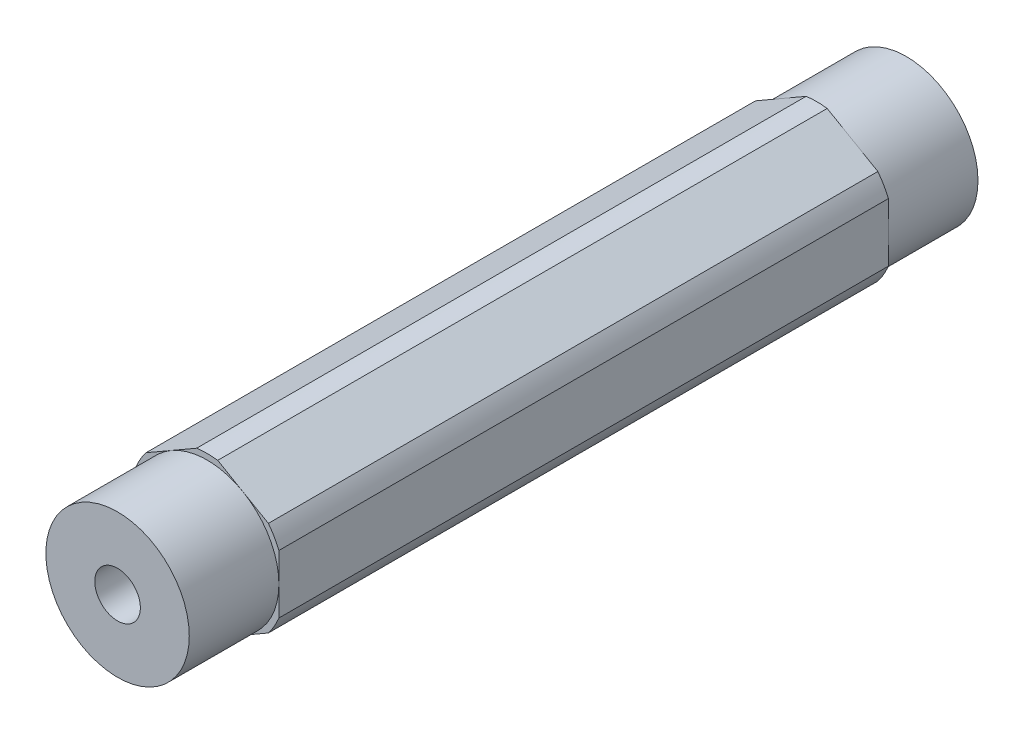
ISO-10303-21;
HEADER;
FILE_DESCRIPTION(('STEP AP214'),'2;1');
FILE_NAME('part.step','',(''),(''),'','','');
FILE_SCHEMA(('AUTOMOTIVE_DESIGN { 1 0 10303 214 1 1 1 1 }'));
ENDSEC;
DATA;
#1=APPLICATION_CONTEXT('core data for automotive mechanical design processes');
#2=APPLICATION_PROTOCOL_DEFINITION('international standard','automotive_design',2000,#1);
#3=PRODUCT_CONTEXT('',#1,'mechanical');
#4=PRODUCT('Part','Part','',(#3));
#5=PRODUCT_RELATED_PRODUCT_CATEGORY('part','',(#4));
#6=PRODUCT_DEFINITION_FORMATION('','',#4);
#7=PRODUCT_DEFINITION_CONTEXT('part definition',#1,'design');
#8=PRODUCT_DEFINITION('design','',#6,#7);
#9=PRODUCT_DEFINITION_SHAPE('','',#8);
#10=(LENGTH_UNIT() NAMED_UNIT(*) SI_UNIT(.MILLI.,.METRE.));
#11=(NAMED_UNIT(*) PLANE_ANGLE_UNIT() SI_UNIT($,.RADIAN.));
#12=(NAMED_UNIT(*) SI_UNIT($,.STERADIAN.) SOLID_ANGLE_UNIT());
#13=UNCERTAINTY_MEASURE_WITH_UNIT(LENGTH_MEASURE(1.E-05),#10,'distance_accuracy_value','');
#14=(GEOMETRIC_REPRESENTATION_CONTEXT(3) GLOBAL_UNCERTAINTY_ASSIGNED_CONTEXT((#13)) GLOBAL_UNIT_ASSIGNED_CONTEXT((#10,
#11,#12)) REPRESENTATION_CONTEXT('',''));
#15=CARTESIAN_POINT('',(0.,0.,0.));
#16=DIRECTION('',(0.,0.,1.));
#17=DIRECTION('',(1.,0.,0.));
#18=AXIS2_PLACEMENT_3D('',#15,#16,#17);
#19=CARTESIAN_POINT('',(0.,0.,-26.9875));
#20=DIRECTION('',(0.,0.,1.));
#21=DIRECTION('',(1.,0.,0.));
#22=AXIS2_PLACEMENT_3D('',#19,#20,#21);
#23=PLANE('',#22);
#24=DIRECTION('',(0.,1.,0.));
#25=VECTOR('',#24,1.);
#26=CARTESIAN_POINT('',(6.35,0.,-26.9875));
#27=LINE('',#26,#25);
#28=CARTESIAN_POINT('',(6.35,0.,-26.9875));
#29=VERTEX_POINT('',#28);
#30=CARTESIAN_POINT('',(6.35,2.59030191290514,-26.9875));
#31=VERTEX_POINT('',#30);
#32=EDGE_CURVE('E175',#29,#31,#27,.T.);
#33=ORIENTED_EDGE('',*,*,#32,.F.);
#34=CARTESIAN_POINT('',(0.,0.,-26.9875));
#35=DIRECTION('',(0.,0.,1.));
#36=DIRECTION('',(1.,0.,0.));
#37=AXIS2_PLACEMENT_3D('',#34,#35,#36);
#38=CIRCLE('',#37,6.35);
#39=CARTESIAN_POINT('',(3.175,5.49926131403119,-26.9875));
#40=VERTEX_POINT('',#39);
#41=EDGE_CURVE('E50',#29,#40,#38,.T.);
#42=ORIENTED_EDGE('',*,*,#41,.T.);
#43=DIRECTION('',(-0.866025403784439,0.5,0.));
#44=VECTOR('',#43,1.);
#45=CARTESIAN_POINT('',(3.175,5.49926131403119,-26.9875));
#46=LINE('',#45,#44);
#47=CARTESIAN_POINT('',(5.41826726004727,4.20411035757862,-26.9875));
#48=VERTEX_POINT('',#47);
#49=EDGE_CURVE('E174',#48,#40,#46,.T.);
#50=ORIENTED_EDGE('',*,*,#49,.F.);
#51=CARTESIAN_POINT('',(0.,0.,-26.9875));
#52=DIRECTION('',(0.,0.,1.));
#53=DIRECTION('',(1.,0.,0.));
#54=AXIS2_PLACEMENT_3D('',#51,#52,#53);
#55=CIRCLE('',#54,6.858);
#56=EDGE_CURVE('E187',#31,#48,#55,.T.);
#57=ORIENTED_EDGE('',*,*,#56,.F.);
#58=EDGE_LOOP('',(#33,#42,#50,#57));
#59=FACE_BOUND('',#58,.T.);
#60=ADVANCED_FACE('F39',(#59),#23,.F.);
#61=CARTESIAN_POINT('',(0.931732739952725,6.79441227048375,-26.9875));
#62=VERTEX_POINT('',#61);
#63=EDGE_CURVE('E181',#40,#62,#46,.T.);
#64=ORIENTED_EDGE('',*,*,#63,.F.);
#65=CARTESIAN_POINT('',(-3.175,5.49926131403119,-26.9875));
#66=VERTEX_POINT('',#65);
#67=EDGE_CURVE('E11',#40,#66,#38,.T.);
#68=ORIENTED_EDGE('',*,*,#67,.T.);
#69=DIRECTION('',(-0.866025403784439,-0.5,0.));
#70=VECTOR('',#69,1.);
#71=CARTESIAN_POINT('',(-3.175,5.49926131403118,-26.9875));
#72=LINE('',#71,#70);
#73=CARTESIAN_POINT('',(-0.931732739952721,6.79441227048375,-26.9875));
#74=VERTEX_POINT('',#73);
#75=EDGE_CURVE('E199',#74,#66,#72,.T.);
#76=ORIENTED_EDGE('',*,*,#75,.F.);
#77=EDGE_CURVE('E183',#62,#74,#55,.T.);
#78=ORIENTED_EDGE('',*,*,#77,.F.);
#79=EDGE_LOOP('',(#64,#68,#76,#78));
#80=FACE_BOUND('',#79,.T.);
#81=ADVANCED_FACE('F182',(#80),#23,.F.);
#82=CARTESIAN_POINT('',(-5.41826726004728,4.20411035757862,-26.9875));
#83=VERTEX_POINT('',#82);
#84=EDGE_CURVE('E194',#66,#83,#72,.T.);
#85=ORIENTED_EDGE('',*,*,#84,.F.);
#86=CARTESIAN_POINT('',(-6.35,0.,-26.9875));
#87=VERTEX_POINT('',#86);
#88=EDGE_CURVE('E48',#66,#87,#38,.T.);
#89=ORIENTED_EDGE('',*,*,#88,.T.);
#90=DIRECTION('',(0.,-1.,0.));
#91=VECTOR('',#90,1.);
#92=CARTESIAN_POINT('',(-6.35,0.,-26.9875));
#93=LINE('',#92,#91);
#94=CARTESIAN_POINT('',(-6.35,2.59030191290514,-26.9875));
#95=VERTEX_POINT('',#94);
#96=EDGE_CURVE('E202',#95,#87,#93,.T.);
#97=ORIENTED_EDGE('',*,*,#96,.F.);
#98=EDGE_CURVE('E196',#83,#95,#55,.T.);
#99=ORIENTED_EDGE('',*,*,#98,.F.);
#100=EDGE_LOOP('',(#85,#89,#97,#99));
#101=FACE_BOUND('',#100,.T.);
#102=ADVANCED_FACE('F376',(#101),#23,.F.);
#103=CARTESIAN_POINT('',(-6.35,-2.59030191290514,-26.9875));
#104=VERTEX_POINT('',#103);
#105=EDGE_CURVE('E206',#87,#104,#93,.T.);
#106=ORIENTED_EDGE('',*,*,#105,.F.);
#107=CARTESIAN_POINT('',(-3.175,-5.49926131403119,-26.9875));
#108=VERTEX_POINT('',#107);
#109=EDGE_CURVE('E340',#87,#108,#38,.T.);
#110=ORIENTED_EDGE('',*,*,#109,.T.);
#111=DIRECTION('',(0.866025403784439,-0.5,0.));
#112=VECTOR('',#111,1.);
#113=CARTESIAN_POINT('',(-3.175,-5.49926131403118,-26.9875));
#114=LINE('',#113,#112);
#115=CARTESIAN_POINT('',(-5.41826726004728,-4.20411035757861,-26.9875));
#116=VERTEX_POINT('',#115);
#117=EDGE_CURVE('E207',#116,#108,#114,.T.);
#118=ORIENTED_EDGE('',*,*,#117,.F.);
#119=EDGE_CURVE('E205',#104,#116,#55,.T.);
#120=ORIENTED_EDGE('',*,*,#119,.F.);
#121=EDGE_LOOP('',(#106,#110,#118,#120));
#122=FACE_BOUND('',#121,.T.);
#123=ADVANCED_FACE('F339',(#122),#23,.F.);
#124=CARTESIAN_POINT('',(-0.931732739952714,-6.79441227048375,-26.9875));
#125=VERTEX_POINT('',#124);
#126=EDGE_CURVE('E211',#108,#125,#114,.T.);
#127=ORIENTED_EDGE('',*,*,#126,.F.);
#128=CARTESIAN_POINT('',(3.175,-5.49926131403119,-26.9875));
#129=VERTEX_POINT('',#128);
#130=EDGE_CURVE('E269',#108,#129,#38,.T.);
#131=ORIENTED_EDGE('',*,*,#130,.T.);
#132=DIRECTION('',(0.866025403784439,0.5,0.));
#133=VECTOR('',#132,1.);
#134=CARTESIAN_POINT('',(3.175,-5.49926131403119,-26.9875));
#135=LINE('',#134,#133);
#136=CARTESIAN_POINT('',(0.931732739952726,-6.79441227048375,-26.9875));
#137=VERTEX_POINT('',#136);
#138=EDGE_CURVE('E212',#137,#129,#135,.T.);
#139=ORIENTED_EDGE('',*,*,#138,.F.);
#140=EDGE_CURVE('E210',#125,#137,#55,.T.);
#141=ORIENTED_EDGE('',*,*,#140,.F.);
#142=EDGE_LOOP('',(#127,#131,#139,#141));
#143=FACE_BOUND('',#142,.T.);
#144=ADVANCED_FACE('F360',(#143),#23,.F.);
#145=CARTESIAN_POINT('',(0.,0.,26.9875));
#146=DIRECTION('',(0.,0.,1.));
#147=DIRECTION('',(1.,0.,0.));
#148=AXIS2_PLACEMENT_3D('',#145,#146,#147);
#149=PLANE('',#148);
#150=CARTESIAN_POINT('',(0.,0.,26.9875));
#151=DIRECTION('',(0.,0.,1.));
#152=DIRECTION('',(1.,0.,0.));
#153=AXIS2_PLACEMENT_3D('',#150,#151,#152);
#154=CIRCLE('',#153,6.35);
#155=CARTESIAN_POINT('',(6.35,0.,26.9875));
#156=VERTEX_POINT('',#155);
#157=CARTESIAN_POINT('',(3.175,5.49926131403119,26.9875));
#158=VERTEX_POINT('',#157);
#159=EDGE_CURVE('E252',#156,#158,#154,.T.);
#160=ORIENTED_EDGE('',*,*,#159,.F.);
#161=DIRECTION('',(0.,1.,0.));
#162=VECTOR('',#161,1.);
#163=CARTESIAN_POINT('',(6.35,0.,26.9875));
#164=LINE('',#163,#162);
#165=CARTESIAN_POINT('',(6.35,2.59030191290514,26.9875));
#166=VERTEX_POINT('',#165);
#167=EDGE_CURVE('E320',#156,#166,#164,.T.);
#168=ORIENTED_EDGE('',*,*,#167,.T.);
#169=CARTESIAN_POINT('',(0.,0.,26.9875));
#170=DIRECTION('',(0.,0.,1.));
#171=DIRECTION('',(1.,0.,0.));
#172=AXIS2_PLACEMENT_3D('',#169,#170,#171);
#173=CIRCLE('',#172,6.858);
#174=CARTESIAN_POINT('',(5.41826726004727,4.20411035757862,26.9875));
#175=VERTEX_POINT('',#174);
#176=EDGE_CURVE('E311',#166,#175,#173,.T.);
#177=ORIENTED_EDGE('',*,*,#176,.T.);
#178=DIRECTION('',(-0.866025403784439,0.5,0.));
#179=VECTOR('',#178,1.);
#180=CARTESIAN_POINT('',(3.175,5.49926131403119,26.9875));
#181=LINE('',#180,#179);
#182=EDGE_CURVE('E314',#175,#158,#181,.T.);
#183=ORIENTED_EDGE('',*,*,#182,.T.);
#184=EDGE_LOOP('',(#160,#168,#177,#183));
#185=FACE_BOUND('',#184,.T.);
#186=ADVANCED_FACE('F357',(#185),#149,.T.);
#187=CARTESIAN_POINT('',(-3.175,5.49926131403119,26.9875));
#188=VERTEX_POINT('',#187);
#189=EDGE_CURVE('E261',#158,#188,#154,.T.);
#190=ORIENTED_EDGE('',*,*,#189,.F.);
#191=CARTESIAN_POINT('',(0.931732739952725,6.79441227048375,26.9875));
#192=VERTEX_POINT('',#191);
#193=EDGE_CURVE('E315',#158,#192,#181,.T.);
#194=ORIENTED_EDGE('',*,*,#193,.T.);
#195=CARTESIAN_POINT('',(-0.931732739952721,6.79441227048375,26.9875));
#196=VERTEX_POINT('',#195);
#197=EDGE_CURVE('E317',#192,#196,#173,.T.);
#198=ORIENTED_EDGE('',*,*,#197,.T.);
#199=DIRECTION('',(-0.866025403784439,-0.5,0.));
#200=VECTOR('',#199,1.);
#201=CARTESIAN_POINT('',(-3.175,5.49926131403118,26.9875));
#202=LINE('',#201,#200);
#203=EDGE_CURVE('E299',#196,#188,#202,.T.);
#204=ORIENTED_EDGE('',*,*,#203,.T.);
#205=EDGE_LOOP('',(#190,#194,#198,#204));
#206=FACE_BOUND('',#205,.T.);
#207=ADVANCED_FACE('F359',(#206),#149,.T.);
#208=CARTESIAN_POINT('',(-6.35,0.,26.9875));
#209=VERTEX_POINT('',#208);
#210=EDGE_CURVE('E267',#188,#209,#154,.T.);
#211=ORIENTED_EDGE('',*,*,#210,.F.);
#212=CARTESIAN_POINT('',(-5.41826726004728,4.20411035757862,26.9875));
#213=VERTEX_POINT('',#212);
#214=EDGE_CURVE('E318',#188,#213,#202,.T.);
#215=ORIENTED_EDGE('',*,*,#214,.T.);
#216=CARTESIAN_POINT('',(-6.35,2.59030191290514,26.9875));
#217=VERTEX_POINT('',#216);
#218=EDGE_CURVE('E286',#213,#217,#173,.T.);
#219=ORIENTED_EDGE('',*,*,#218,.T.);
#220=DIRECTION('',(0.,-1.,0.));
#221=VECTOR('',#220,1.);
#222=CARTESIAN_POINT('',(-6.35,0.,26.9875));
#223=LINE('',#222,#221);
#224=EDGE_CURVE('E284',#217,#209,#223,.T.);
#225=ORIENTED_EDGE('',*,*,#224,.T.);
#226=EDGE_LOOP('',(#211,#215,#219,#225));
#227=FACE_BOUND('',#226,.T.);
#228=ADVANCED_FACE('F289',(#227),#149,.T.);
#229=CARTESIAN_POINT('',(-3.175,-5.49926131403118,26.9875));
#230=VERTEX_POINT('',#229);
#231=EDGE_CURVE('E256',#209,#230,#154,.T.);
#232=ORIENTED_EDGE('',*,*,#231,.F.);
#233=CARTESIAN_POINT('',(-6.35,-2.59030191290514,26.9875));
#234=VERTEX_POINT('',#233);
#235=EDGE_CURVE('E276',#209,#234,#223,.T.);
#236=ORIENTED_EDGE('',*,*,#235,.T.);
#237=CARTESIAN_POINT('',(-5.41826726004728,-4.20411035757861,26.9875));
#238=VERTEX_POINT('',#237);
#239=EDGE_CURVE('E293',#234,#238,#173,.T.);
#240=ORIENTED_EDGE('',*,*,#239,.T.);
#241=DIRECTION('',(0.866025403784439,-0.5,0.));
#242=VECTOR('',#241,1.);
#243=CARTESIAN_POINT('',(-3.175,-5.49926131403118,26.9875));
#244=LINE('',#243,#242);
#245=EDGE_CURVE('E279',#238,#230,#244,.T.);
#246=ORIENTED_EDGE('',*,*,#245,.T.);
#247=EDGE_LOOP('',(#232,#236,#240,#246));
#248=FACE_BOUND('',#247,.T.);
#249=ADVANCED_FACE('F275',(#248),#149,.T.);
#250=CARTESIAN_POINT('',(3.175,-5.49926131403119,26.9875));
#251=VERTEX_POINT('',#250);
#252=EDGE_CURVE('E250',#230,#251,#154,.T.);
#253=ORIENTED_EDGE('',*,*,#252,.F.);
#254=CARTESIAN_POINT('',(-0.931732739952714,-6.79441227048375,26.9875));
#255=VERTEX_POINT('',#254);
#256=EDGE_CURVE('E294',#230,#255,#244,.T.);
#257=ORIENTED_EDGE('',*,*,#256,.T.);
#258=CARTESIAN_POINT('',(0.931732739952726,-6.79441227048375,26.9875));
#259=VERTEX_POINT('',#258);
#260=EDGE_CURVE('E296',#255,#259,#173,.T.);
#261=ORIENTED_EDGE('',*,*,#260,.T.);
#262=DIRECTION('',(0.866025403784439,0.5,0.));
#263=VECTOR('',#262,1.);
#264=CARTESIAN_POINT('',(3.175,-5.49926131403119,26.9875));
#265=LINE('',#264,#263);
#266=EDGE_CURVE('E302',#259,#251,#265,.T.);
#267=ORIENTED_EDGE('',*,*,#266,.T.);
#268=EDGE_LOOP('',(#253,#257,#261,#267));
#269=FACE_BOUND('',#268,.T.);
#270=ADVANCED_FACE('F348',(#269),#149,.T.);
#271=CARTESIAN_POINT('',(6.35,0.,26.9875));
#272=DIRECTION('',(-1.,0.,0.));
#273=DIRECTION('',(0.,-1.,0.));
#274=AXIS2_PLACEMENT_3D('',#271,#272,#273);
#275=PLANE('',#274);
#276=CARTESIAN_POINT('',(6.35,-2.59030191290513,-26.9875));
#277=VERTEX_POINT('',#276);
#278=EDGE_CURVE('E305',#277,#29,#27,.T.);
#279=ORIENTED_EDGE('',*,*,#278,.T.);
#280=ORIENTED_EDGE('',*,*,#32,.T.);
#281=DIRECTION('',(0.,0.,-1.));
#282=VECTOR('',#281,1.);
#283=CARTESIAN_POINT('',(6.35,2.59030191290514,26.9875));
#284=LINE('',#283,#282);
#285=EDGE_CURVE('E43',#166,#31,#284,.T.);
#286=ORIENTED_EDGE('',*,*,#285,.F.);
#287=ORIENTED_EDGE('',*,*,#167,.F.);
#288=CARTESIAN_POINT('',(6.35,-2.59030191290513,26.9875));
#289=VERTEX_POINT('',#288);
#290=EDGE_CURVE('E319',#289,#156,#164,.T.);
#291=ORIENTED_EDGE('',*,*,#290,.F.);
#292=DIRECTION('',(0.,0.,-1.));
#293=VECTOR('',#292,1.);
#294=CARTESIAN_POINT('',(6.35,-2.59030191290513,26.9875));
#295=LINE('',#294,#293);
#296=EDGE_CURVE('E217',#289,#277,#295,.T.);
#297=ORIENTED_EDGE('',*,*,#296,.T.);
#298=EDGE_LOOP('',(#279,#280,#286,#287,#291,#297));
#299=FACE_BOUND('',#298,.T.);
#300=ADVANCED_FACE('F308',(#299),#275,.F.);
#301=CARTESIAN_POINT('',(0.,0.,26.9875));
#302=DIRECTION('',(0.,0.,-1.));
#303=DIRECTION('',(-1.,0.,0.));
#304=AXIS2_PLACEMENT_3D('',#301,#302,#303);
#305=CYLINDRICAL_SURFACE('',#304,6.858);
#306=ORIENTED_EDGE('',*,*,#56,.T.);
#307=DIRECTION('',(0.,0.,-1.));
#308=VECTOR('',#307,1.);
#309=CARTESIAN_POINT('',(5.41826726004727,4.20411035757862,26.9875));
#310=LINE('',#309,#308);
#311=EDGE_CURVE('E193',#175,#48,#310,.T.);
#312=ORIENTED_EDGE('',*,*,#311,.F.);
#313=ORIENTED_EDGE('',*,*,#176,.F.);
#314=ORIENTED_EDGE('',*,*,#285,.T.);
#315=EDGE_LOOP('',(#306,#312,#313,#314));
#316=FACE_BOUND('',#315,.T.);
#317=ADVANCED_FACE('F310',(#316),#305,.T.);
#318=CARTESIAN_POINT('',(3.175,5.49926131403119,26.9875));
#319=DIRECTION('',(-0.5,-0.866025403784439,0.));
#320=DIRECTION('',(0.866025403784439,-0.5,0.));
#321=AXIS2_PLACEMENT_3D('',#318,#319,#320);
#322=PLANE('',#321);
#323=ORIENTED_EDGE('',*,*,#49,.T.);
#324=ORIENTED_EDGE('',*,*,#63,.T.);
#325=DIRECTION('',(0.,0.,-1.));
#326=VECTOR('',#325,1.);
#327=CARTESIAN_POINT('',(0.931732739952725,6.79441227048375,26.9875));
#328=LINE('',#327,#326);
#329=EDGE_CURVE('E245',#192,#62,#328,.T.);
#330=ORIENTED_EDGE('',*,*,#329,.F.);
#331=ORIENTED_EDGE('',*,*,#193,.F.);
#332=ORIENTED_EDGE('',*,*,#182,.F.);
#333=ORIENTED_EDGE('',*,*,#311,.T.);
#334=EDGE_LOOP('',(#323,#324,#330,#331,#332,#333));
#335=FACE_BOUND('',#334,.T.);
#336=ADVANCED_FACE('F190',(#335),#322,.F.);
#337=ORIENTED_EDGE('',*,*,#77,.T.);
#338=DIRECTION('',(0.,0.,-1.));
#339=VECTOR('',#338,1.);
#340=CARTESIAN_POINT('',(-0.931732739952721,6.79441227048375,26.9875));
#341=LINE('',#340,#339);
#342=EDGE_CURVE('E242',#196,#74,#341,.T.);
#343=ORIENTED_EDGE('',*,*,#342,.F.);
#344=ORIENTED_EDGE('',*,*,#197,.F.);
#345=ORIENTED_EDGE('',*,*,#329,.T.);
#346=EDGE_LOOP('',(#337,#343,#344,#345));
#347=FACE_BOUND('',#346,.T.);
#348=ADVANCED_FACE('F419',(#347),#305,.T.);
#349=CARTESIAN_POINT('',(-3.175,5.49926131403118,26.9875));
#350=DIRECTION('',(0.5,-0.866025403784439,0.));
#351=DIRECTION('',(0.866025403784439,0.5,0.));
#352=AXIS2_PLACEMENT_3D('',#349,#350,#351);
#353=PLANE('',#352);
#354=ORIENTED_EDGE('',*,*,#75,.T.);
#355=ORIENTED_EDGE('',*,*,#84,.T.);
#356=DIRECTION('',(0.,0.,-1.));
#357=VECTOR('',#356,1.);
#358=CARTESIAN_POINT('',(-5.41826726004728,4.20411035757862,26.9875));
#359=LINE('',#358,#357);
#360=EDGE_CURVE('E239',#213,#83,#359,.T.);
#361=ORIENTED_EDGE('',*,*,#360,.F.);
#362=ORIENTED_EDGE('',*,*,#214,.F.);
#363=ORIENTED_EDGE('',*,*,#203,.F.);
#364=ORIENTED_EDGE('',*,*,#342,.T.);
#365=EDGE_LOOP('',(#354,#355,#361,#362,#363,#364));
#366=FACE_BOUND('',#365,.T.);
#367=ADVANCED_FACE('F416',(#366),#353,.F.);
#368=ORIENTED_EDGE('',*,*,#98,.T.);
#369=DIRECTION('',(0.,0.,-1.));
#370=VECTOR('',#369,1.);
#371=CARTESIAN_POINT('',(-6.35,2.59030191290514,26.9875));
#372=LINE('',#371,#370);
#373=EDGE_CURVE('E236',#217,#95,#372,.T.);
#374=ORIENTED_EDGE('',*,*,#373,.F.);
#375=ORIENTED_EDGE('',*,*,#218,.F.);
#376=ORIENTED_EDGE('',*,*,#360,.T.);
#377=EDGE_LOOP('',(#368,#374,#375,#376));
#378=FACE_BOUND('',#377,.T.);
#379=ADVANCED_FACE('F415',(#378),#305,.T.);
#380=CARTESIAN_POINT('',(-6.35,0.,26.9875));
#381=DIRECTION('',(1.,0.,0.));
#382=DIRECTION('',(0.,1.,0.));
#383=AXIS2_PLACEMENT_3D('',#380,#381,#382);
#384=PLANE('',#383);
#385=ORIENTED_EDGE('',*,*,#96,.T.);
#386=ORIENTED_EDGE('',*,*,#105,.T.);
#387=DIRECTION('',(0.,0.,-1.));
#388=VECTOR('',#387,1.);
#389=CARTESIAN_POINT('',(-6.35,-2.59030191290514,26.9875));
#390=LINE('',#389,#388);
#391=EDGE_CURVE('E233',#234,#104,#390,.T.);
#392=ORIENTED_EDGE('',*,*,#391,.F.);
#393=ORIENTED_EDGE('',*,*,#235,.F.);
#394=ORIENTED_EDGE('',*,*,#224,.F.);
#395=ORIENTED_EDGE('',*,*,#373,.T.);
#396=EDGE_LOOP('',(#385,#386,#392,#393,#394,#395));
#397=FACE_BOUND('',#396,.T.);
#398=ADVANCED_FACE('F283',(#397),#384,.F.);
#399=ORIENTED_EDGE('',*,*,#119,.T.);
#400=DIRECTION('',(0.,0.,-1.));
#401=VECTOR('',#400,1.);
#402=CARTESIAN_POINT('',(-5.41826726004728,-4.20411035757861,26.9875));
#403=LINE('',#402,#401);
#404=EDGE_CURVE('E230',#238,#116,#403,.T.);
#405=ORIENTED_EDGE('',*,*,#404,.F.);
#406=ORIENTED_EDGE('',*,*,#239,.F.);
#407=ORIENTED_EDGE('',*,*,#391,.T.);
#408=EDGE_LOOP('',(#399,#405,#406,#407));
#409=FACE_BOUND('',#408,.T.);
#410=ADVANCED_FACE('F337',(#409),#305,.T.);
#411=CARTESIAN_POINT('',(-3.175,-5.49926131403118,26.9875));
#412=DIRECTION('',(0.5,0.866025403784439,0.));
#413=DIRECTION('',(-0.866025403784439,0.5,0.));
#414=AXIS2_PLACEMENT_3D('',#411,#412,#413);
#415=PLANE('',#414);
#416=ORIENTED_EDGE('',*,*,#117,.T.);
#417=ORIENTED_EDGE('',*,*,#126,.T.);
#418=DIRECTION('',(0.,0.,-1.));
#419=VECTOR('',#418,1.);
#420=CARTESIAN_POINT('',(-0.931732739952714,-6.79441227048375,26.9875));
#421=LINE('',#420,#419);
#422=EDGE_CURVE('E227',#255,#125,#421,.T.);
#423=ORIENTED_EDGE('',*,*,#422,.F.);
#424=ORIENTED_EDGE('',*,*,#256,.F.);
#425=ORIENTED_EDGE('',*,*,#245,.F.);
#426=ORIENTED_EDGE('',*,*,#404,.T.);
#427=EDGE_LOOP('',(#416,#417,#423,#424,#425,#426));
#428=FACE_BOUND('',#427,.T.);
#429=ADVANCED_FACE('F343',(#428),#415,.F.);
#430=ORIENTED_EDGE('',*,*,#140,.T.);
#431=DIRECTION('',(0.,0.,-1.));
#432=VECTOR('',#431,1.);
#433=CARTESIAN_POINT('',(0.931732739952726,-6.79441227048375,26.9875));
#434=LINE('',#433,#432);
#435=EDGE_CURVE('E224',#259,#137,#434,.T.);
#436=ORIENTED_EDGE('',*,*,#435,.F.);
#437=ORIENTED_EDGE('',*,*,#260,.F.);
#438=ORIENTED_EDGE('',*,*,#422,.T.);
#439=EDGE_LOOP('',(#430,#436,#437,#438));
#440=FACE_BOUND('',#439,.T.);
#441=ADVANCED_FACE('F403',(#440),#305,.T.);
#442=CARTESIAN_POINT('',(3.175,-5.49926131403119,26.9875));
#443=DIRECTION('',(-0.5,0.866025403784439,0.));
#444=DIRECTION('',(-0.866025403784439,-0.5,0.));
#445=AXIS2_PLACEMENT_3D('',#442,#443,#444);
#446=PLANE('',#445);
#447=ORIENTED_EDGE('',*,*,#138,.T.);
#448=CARTESIAN_POINT('',(5.41826726004727,-4.20411035757862,-26.9875));
#449=VERTEX_POINT('',#448);
#450=EDGE_CURVE('E216',#129,#449,#135,.T.);
#451=ORIENTED_EDGE('',*,*,#450,.T.);
#452=DIRECTION('',(0.,0.,-1.));
#453=VECTOR('',#452,1.);
#454=CARTESIAN_POINT('',(5.41826726004727,-4.20411035757862,26.9875));
#455=LINE('',#454,#453);
#456=CARTESIAN_POINT('',(5.41826726004727,-4.20411035757862,26.9875));
#457=VERTEX_POINT('',#456);
#458=EDGE_CURVE('E220',#457,#449,#455,.T.);
#459=ORIENTED_EDGE('',*,*,#458,.F.);
#460=EDGE_CURVE('E304',#251,#457,#265,.T.);
#461=ORIENTED_EDGE('',*,*,#460,.F.);
#462=ORIENTED_EDGE('',*,*,#266,.F.);
#463=ORIENTED_EDGE('',*,*,#435,.T.);
#464=EDGE_LOOP('',(#447,#451,#459,#461,#462,#463));
#465=FACE_BOUND('',#464,.T.);
#466=ADVANCED_FACE('F351',(#465),#446,.F.);
#467=CARTESIAN_POINT('',(0.,0.,26.9875));
#468=DIRECTION('',(0.,0.,-1.));
#469=DIRECTION('',(-1.,0.,0.));
#470=AXIS2_PLACEMENT_3D('',#467,#468,#469);
#471=CYLINDRICAL_SURFACE('',#470,2.0193);
#472=CARTESIAN_POINT('',(0.,0.,34.925));
#473=DIRECTION('',(0.,0.,1.));
#474=DIRECTION('',(1.,0.,0.));
#475=AXIS2_PLACEMENT_3D('',#472,#473,#474);
#476=CIRCLE('',#475,2.0193);
#477=CARTESIAN_POINT('',(2.0193,0.,34.925));
#478=VERTEX_POINT('',#477);
#479=EDGE_CURVE('E260',#478,#478,#476,.T.);
#480=ORIENTED_EDGE('',*,*,#479,.T.);
#481=EDGE_LOOP('',(#480));
#482=FACE_BOUND('',#481,.T.);
#483=CARTESIAN_POINT('',(0.,0.,-34.925));
#484=DIRECTION('',(0.,0.,1.));
#485=DIRECTION('',(1.,0.,0.));
#486=AXIS2_PLACEMENT_3D('',#483,#484,#485);
#487=CIRCLE('',#486,2.0193);
#488=CARTESIAN_POINT('',(2.0193,0.,-34.925));
#489=VERTEX_POINT('',#488);
#490=EDGE_CURVE('E178',#489,#489,#487,.T.);
#491=ORIENTED_EDGE('',*,*,#490,.F.);
#492=EDGE_LOOP('',(#491));
#493=FACE_BOUND('',#492,.T.);
#494=ADVANCED_FACE('F41',(#482,#493),#471,.F.);
#495=EDGE_CURVE('E215',#449,#277,#55,.T.);
#496=ORIENTED_EDGE('',*,*,#495,.T.);
#497=ORIENTED_EDGE('',*,*,#296,.F.);
#498=EDGE_CURVE('E221',#457,#289,#173,.T.);
#499=ORIENTED_EDGE('',*,*,#498,.F.);
#500=ORIENTED_EDGE('',*,*,#458,.T.);
#501=EDGE_LOOP('',(#496,#497,#499,#500));
#502=FACE_BOUND('',#501,.T.);
#503=ADVANCED_FACE('F356',(#502),#305,.T.);
#504=EDGE_CURVE('E64',#251,#156,#154,.T.);
#505=ORIENTED_EDGE('',*,*,#504,.F.);
#506=ORIENTED_EDGE('',*,*,#460,.T.);
#507=ORIENTED_EDGE('',*,*,#498,.T.);
#508=ORIENTED_EDGE('',*,*,#290,.T.);
#509=EDGE_LOOP('',(#505,#506,#507,#508));
#510=FACE_BOUND('',#509,.T.);
#511=ADVANCED_FACE('F355',(#510),#149,.T.);
#512=ORIENTED_EDGE('',*,*,#450,.F.);
#513=EDGE_CURVE('E179',#129,#29,#38,.T.);
#514=ORIENTED_EDGE('',*,*,#513,.T.);
#515=ORIENTED_EDGE('',*,*,#278,.F.);
#516=ORIENTED_EDGE('',*,*,#495,.F.);
#517=EDGE_LOOP('',(#512,#514,#515,#516));
#518=FACE_BOUND('',#517,.T.);
#519=ADVANCED_FACE('F369',(#518),#23,.F.);
#520=CARTESIAN_POINT('',(0.,0.,34.925));
#521=DIRECTION('',(0.,0.,1.));
#522=DIRECTION('',(1.,0.,0.));
#523=AXIS2_PLACEMENT_3D('',#520,#521,#522);
#524=PLANE('',#523);
#525=CARTESIAN_POINT('',(0.,0.,34.925));
#526=DIRECTION('',(0.,0.,1.));
#527=DIRECTION('',(1.,0.,0.));
#528=AXIS2_PLACEMENT_3D('',#525,#526,#527);
#529=CIRCLE('',#528,6.35);
#530=CARTESIAN_POINT('',(6.35,0.,34.925));
#531=VERTEX_POINT('',#530);
#532=EDGE_CURVE('E259',#531,#531,#529,.T.);
#533=ORIENTED_EDGE('',*,*,#532,.T.);
#534=EDGE_LOOP('',(#533));
#535=FACE_BOUND('',#534,.T.);
#536=ORIENTED_EDGE('',*,*,#479,.F.);
#537=EDGE_LOOP('',(#536));
#538=FACE_BOUND('',#537,.T.);
#539=ADVANCED_FACE('F379',(#535,#538),#524,.T.);
#540=CARTESIAN_POINT('',(0.,0.,34.925));
#541=DIRECTION('',(0.,0.,-1.));
#542=DIRECTION('',(-1.,0.,0.));
#543=AXIS2_PLACEMENT_3D('',#540,#541,#542);
#544=CYLINDRICAL_SURFACE('',#543,6.35);
#545=ORIENTED_EDGE('',*,*,#532,.F.);
#546=EDGE_LOOP('',(#545));
#547=FACE_BOUND('',#546,.T.);
#548=ORIENTED_EDGE('',*,*,#159,.T.);
#549=ORIENTED_EDGE('',*,*,#189,.T.);
#550=ORIENTED_EDGE('',*,*,#210,.T.);
#551=ORIENTED_EDGE('',*,*,#231,.T.);
#552=ORIENTED_EDGE('',*,*,#252,.T.);
#553=ORIENTED_EDGE('',*,*,#504,.T.);
#554=EDGE_LOOP('',(#548,#549,#550,#551,#552,#553));
#555=FACE_BOUND('',#554,.T.);
#556=ADVANCED_FACE('F271',(#547,#555),#544,.T.);
#557=CARTESIAN_POINT('',(0.,0.,-34.925));
#558=DIRECTION('',(0.,0.,1.));
#559=DIRECTION('',(1.,0.,0.));
#560=AXIS2_PLACEMENT_3D('',#557,#558,#559);
#561=CYLINDRICAL_SURFACE('',#560,6.35);
#562=CARTESIAN_POINT('',(0.,0.,-34.925));
#563=DIRECTION('',(0.,0.,1.));
#564=DIRECTION('',(1.,0.,0.));
#565=AXIS2_PLACEMENT_3D('',#562,#563,#564);
#566=CIRCLE('',#565,6.35);
#567=CARTESIAN_POINT('',(6.35,0.,-34.925));
#568=VERTEX_POINT('',#567);
#569=EDGE_CURVE('E177',#568,#568,#566,.T.);
#570=ORIENTED_EDGE('',*,*,#569,.T.);
#571=EDGE_LOOP('',(#570));
#572=FACE_BOUND('',#571,.T.);
#573=ORIENTED_EDGE('',*,*,#41,.F.);
#574=ORIENTED_EDGE('',*,*,#513,.F.);
#575=ORIENTED_EDGE('',*,*,#130,.F.);
#576=ORIENTED_EDGE('',*,*,#109,.F.);
#577=ORIENTED_EDGE('',*,*,#88,.F.);
#578=ORIENTED_EDGE('',*,*,#67,.F.);
#579=EDGE_LOOP('',(#573,#574,#575,#576,#577,#578));
#580=FACE_BOUND('',#579,.T.);
#581=ADVANCED_FACE('F163',(#572,#580),#561,.T.);
#582=CARTESIAN_POINT('',(0.,0.,-34.925));
#583=DIRECTION('',(0.,0.,-1.));
#584=DIRECTION('',(1.,0.,0.));
#585=AXIS2_PLACEMENT_3D('',#582,#583,#584);
#586=PLANE('',#585);
#587=ORIENTED_EDGE('',*,*,#490,.T.);
#588=EDGE_LOOP('',(#587));
#589=FACE_BOUND('',#588,.T.);
#590=ORIENTED_EDGE('',*,*,#569,.F.);
#591=EDGE_LOOP('',(#590));
#592=FACE_BOUND('',#591,.T.);
#593=ADVANCED_FACE('F394',(#589,#592),#586,.T.);
#594=CLOSED_SHELL('',(#60,#81,#102,#123,#144,#186,#207,#228,#249,#270,#300,#317,#336,#348,#367,
#379,#398,#410,#429,#441,#466,#494,#503,#511,#519,#539,#556,#581,#593));
#595=MANIFOLD_SOLID_BREP('B2',#594);
#596=ADVANCED_BREP_SHAPE_REPRESENTATION('',(#18,#595),#14);
#597=SHAPE_DEFINITION_REPRESENTATION(#9,#596);
ENDSEC;
END-ISO-10303-21;
